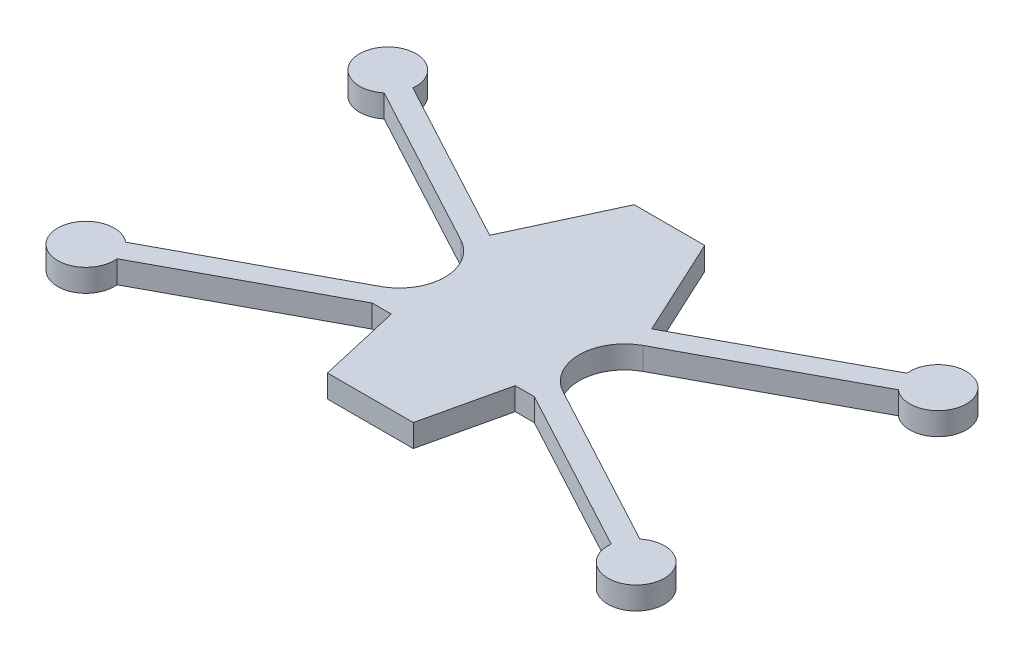
ISO-10303-21;
HEADER;
FILE_DESCRIPTION(('STEP AP214'),'2;1');
FILE_NAME('part.step','',(''),(''),'','','');
FILE_SCHEMA(('AUTOMOTIVE_DESIGN { 1 0 10303 214 1 1 1 1 }'));
ENDSEC;
DATA;
#1=APPLICATION_CONTEXT('core data for automotive mechanical design processes');
#2=APPLICATION_PROTOCOL_DEFINITION('international standard','automotive_design',2000,#1);
#3=PRODUCT_CONTEXT('',#1,'mechanical');
#4=PRODUCT('Part','Part','',(#3));
#5=PRODUCT_RELATED_PRODUCT_CATEGORY('part','',(#4));
#6=PRODUCT_DEFINITION_FORMATION('','',#4);
#7=PRODUCT_DEFINITION_CONTEXT('part definition',#1,'design');
#8=PRODUCT_DEFINITION('design','',#6,#7);
#9=PRODUCT_DEFINITION_SHAPE('','',#8);
#10=(LENGTH_UNIT() NAMED_UNIT(*) SI_UNIT(.MILLI.,.METRE.));
#11=(NAMED_UNIT(*) PLANE_ANGLE_UNIT() SI_UNIT($,.RADIAN.));
#12=(NAMED_UNIT(*) SI_UNIT($,.STERADIAN.) SOLID_ANGLE_UNIT());
#13=UNCERTAINTY_MEASURE_WITH_UNIT(LENGTH_MEASURE(1.E-05),#10,'distance_accuracy_value','');
#14=(GEOMETRIC_REPRESENTATION_CONTEXT(3) GLOBAL_UNCERTAINTY_ASSIGNED_CONTEXT((#13)) GLOBAL_UNIT_ASSIGNED_CONTEXT((#10,
#11,#12)) REPRESENTATION_CONTEXT('',''));
#15=CARTESIAN_POINT('',(0.,0.,0.));
#16=DIRECTION('',(0.,0.,1.));
#17=DIRECTION('',(1.,0.,0.));
#18=AXIS2_PLACEMENT_3D('',#15,#16,#17);
#19=CARTESIAN_POINT('',(247.65,20.32,-135.89));
#20=DIRECTION('',(0.,-1.,0.));
#21=DIRECTION('',(0.,0.,-1.));
#22=AXIS2_PLACEMENT_3D('',#19,#20,#21);
#23=CYLINDRICAL_SURFACE('',#22,25.4);
#24=CARTESIAN_POINT('',(247.65,0.,-135.89));
#25=DIRECTION('',(0.,1.,0.));
#26=DIRECTION('',(0.,0.,1.));
#27=AXIS2_PLACEMENT_3D('',#24,#25,#26);
#28=CIRCLE('',#27,25.4);
#29=CARTESIAN_POINT('',(231.416447366997,0.,-116.354602156303));
#30=VERTEX_POINT('',#29);
#31=CARTESIAN_POINT('',(222.399785176288,0.,-133.135612344567));
#32=VERTEX_POINT('',#31);
#33=EDGE_CURVE('E215',#30,#32,#28,.T.);
#34=ORIENTED_EDGE('',*,*,#33,.T.);
#35=DIRECTION('',(0.,-1.,0.));
#36=VECTOR('',#35,1.);
#37=CARTESIAN_POINT('',(222.399785176288,20.32,-133.135612344567));
#38=LINE('',#37,#36);
#39=CARTESIAN_POINT('',(222.399785176288,20.32,-133.135612344567));
#40=VERTEX_POINT('',#39);
#41=EDGE_CURVE('E11',#40,#32,#38,.T.);
#42=ORIENTED_EDGE('',*,*,#41,.F.);
#43=CARTESIAN_POINT('',(247.65,20.32,-135.89));
#44=DIRECTION('',(0.,1.,0.));
#45=DIRECTION('',(0.,0.,1.));
#46=AXIS2_PLACEMENT_3D('',#43,#44,#45);
#47=CIRCLE('',#46,25.4);
#48=CARTESIAN_POINT('',(231.416447366997,20.32,-116.354602156303));
#49=VERTEX_POINT('',#48);
#50=EDGE_CURVE('E258',#49,#40,#47,.T.);
#51=ORIENTED_EDGE('',*,*,#50,.F.);
#52=DIRECTION('',(0.,-1.,0.));
#53=VECTOR('',#52,1.);
#54=CARTESIAN_POINT('',(231.416447366997,20.32,-116.354602156303));
#55=LINE('',#54,#53);
#56=EDGE_CURVE('E211',#49,#30,#55,.T.);
#57=ORIENTED_EDGE('',*,*,#56,.T.);
#58=EDGE_LOOP('',(#34,#42,#51,#57));
#59=FACE_BOUND('',#58,.T.);
#60=ADVANCED_FACE('F35',(#59),#23,.T.);
#61=CARTESIAN_POINT('',(222.399785176288,20.32,-133.135612344567));
#62=DIRECTION('',(0.473315600562165,0.,0.880892923268474));
#63=DIRECTION('',(0.880892923268474,0.,-0.473315600562165));
#64=AXIS2_PLACEMENT_3D('',#61,#62,#63);
#65=PLANE('',#64);
#66=DIRECTION('',(-0.880892923268474,0.,0.473315600562165));
#67=VECTOR('',#66,1.);
#68=CARTESIAN_POINT('',(222.399785176288,0.,-133.135612344567));
#69=LINE('',#68,#67);
#70=CARTESIAN_POINT('',(72.9616689046454,0.,-52.8405050941322));
#71=VERTEX_POINT('',#70);
#72=EDGE_CURVE('E218',#32,#71,#69,.T.);
#73=ORIENTED_EDGE('',*,*,#72,.T.);
#74=DIRECTION('',(0.,-1.,0.));
#75=VECTOR('',#74,1.);
#76=CARTESIAN_POINT('',(72.9616689046454,20.32,-52.8405050941322));
#77=LINE('',#76,#75);
#78=CARTESIAN_POINT('',(72.9616689046454,20.32,-52.8405050941322));
#79=VERTEX_POINT('',#78);
#80=EDGE_CURVE('E43',#79,#71,#77,.T.);
#81=ORIENTED_EDGE('',*,*,#80,.F.);
#82=DIRECTION('',(-0.880892923268474,0.,0.473315600562165));
#83=VECTOR('',#82,1.);
#84=CARTESIAN_POINT('',(222.399785176288,20.32,-133.135612344567));
#85=LINE('',#84,#83);
#86=EDGE_CURVE('E136',#40,#79,#85,.T.);
#87=ORIENTED_EDGE('',*,*,#86,.F.);
#88=ORIENTED_EDGE('',*,*,#41,.T.);
#89=EDGE_LOOP('',(#73,#81,#87,#88));
#90=FACE_BOUND('',#89,.T.);
#91=ADVANCED_FACE('F386',(#90),#65,.F.);
#92=CARTESIAN_POINT('',(31.75,20.32,-141.740505094132));
#93=DIRECTION('',(-0.907255673431609,0.,0.420579532343358));
#94=DIRECTION('',(0.420579532343358,0.,0.907255673431609));
#95=AXIS2_PLACEMENT_3D('',#92,#93,#94);
#96=PLANE('',#95);
#97=DIRECTION('',(-0.420579532343359,0.,-0.907255673431609));
#98=VECTOR('',#97,1.);
#99=CARTESIAN_POINT('',(31.75,0.,-141.740505094132));
#100=LINE('',#99,#98);
#101=CARTESIAN_POINT('',(31.75,0.,-141.740505094132));
#102=VERTEX_POINT('',#101);
#103=EDGE_CURVE('E220',#71,#102,#100,.T.);
#104=ORIENTED_EDGE('',*,*,#103,.T.);
#105=DIRECTION('',(0.,-1.,0.));
#106=VECTOR('',#105,1.);
#107=CARTESIAN_POINT('',(31.75,20.32,-141.740505094132));
#108=LINE('',#107,#106);
#109=CARTESIAN_POINT('',(31.75,20.32,-141.740505094132));
#110=VERTEX_POINT('',#109);
#111=EDGE_CURVE('E307',#110,#102,#108,.T.);
#112=ORIENTED_EDGE('',*,*,#111,.F.);
#113=DIRECTION('',(-0.420579532343359,0.,-0.907255673431609));
#114=VECTOR('',#113,1.);
#115=CARTESIAN_POINT('',(31.75,20.32,-141.740505094132));
#116=LINE('',#115,#114);
#117=EDGE_CURVE('E315',#79,#110,#116,.T.);
#118=ORIENTED_EDGE('',*,*,#117,.F.);
#119=ORIENTED_EDGE('',*,*,#80,.T.);
#120=EDGE_LOOP('',(#104,#112,#118,#119));
#121=FACE_BOUND('',#120,.T.);
#122=ADVANCED_FACE('F313',(#121),#96,.F.);
#123=CARTESIAN_POINT('',(-31.75,20.32,-141.740505094132));
#124=DIRECTION('',(0.,0.,1.));
#125=DIRECTION('',(1.,0.,0.));
#126=AXIS2_PLACEMENT_3D('',#123,#124,#125);
#127=PLANE('',#126);
#128=DIRECTION('',(-1.,0.,0.));
#129=VECTOR('',#128,1.);
#130=CARTESIAN_POINT('',(-31.75,0.,-141.740505094132));
#131=LINE('',#130,#129);
#132=CARTESIAN_POINT('',(-31.75,0.,-141.740505094132));
#133=VERTEX_POINT('',#132);
#134=EDGE_CURVE('E222',#102,#133,#131,.T.);
#135=ORIENTED_EDGE('',*,*,#134,.T.);
#136=DIRECTION('',(0.,-1.,0.));
#137=VECTOR('',#136,1.);
#138=CARTESIAN_POINT('',(-31.75,20.32,-141.740505094132));
#139=LINE('',#138,#137);
#140=CARTESIAN_POINT('',(-31.75,20.32,-141.740505094132));
#141=VERTEX_POINT('',#140);
#142=EDGE_CURVE('E304',#141,#133,#139,.T.);
#143=ORIENTED_EDGE('',*,*,#142,.F.);
#144=DIRECTION('',(-1.,0.,0.));
#145=VECTOR('',#144,1.);
#146=CARTESIAN_POINT('',(-31.75,20.32,-141.740505094132));
#147=LINE('',#146,#145);
#148=EDGE_CURVE('E333',#110,#141,#147,.T.);
#149=ORIENTED_EDGE('',*,*,#148,.F.);
#150=ORIENTED_EDGE('',*,*,#111,.T.);
#151=EDGE_LOOP('',(#135,#143,#149,#150));
#152=FACE_BOUND('',#151,.T.);
#153=ADVANCED_FACE('F324',(#152),#127,.F.);
#154=CARTESIAN_POINT('',(-72.9616689046454,20.32,-52.8405050941322));
#155=DIRECTION('',(0.907255673431609,0.,0.420579532343358));
#156=DIRECTION('',(0.420579532343358,0.,-0.907255673431609));
#157=AXIS2_PLACEMENT_3D('',#154,#155,#156);
#158=PLANE('',#157);
#159=DIRECTION('',(-0.420579532343358,0.,0.907255673431609));
#160=VECTOR('',#159,1.);
#161=CARTESIAN_POINT('',(-72.9616689046454,0.,-52.8405050941322));
#162=LINE('',#161,#160);
#163=CARTESIAN_POINT('',(-72.9616689046454,0.,-52.8405050941322));
#164=VERTEX_POINT('',#163);
#165=EDGE_CURVE('E224',#133,#164,#162,.T.);
#166=ORIENTED_EDGE('',*,*,#165,.T.);
#167=DIRECTION('',(0.,-1.,0.));
#168=VECTOR('',#167,1.);
#169=CARTESIAN_POINT('',(-72.9616689046454,20.32,-52.8405050941322));
#170=LINE('',#169,#168);
#171=CARTESIAN_POINT('',(-72.9616689046454,20.32,-52.8405050941322));
#172=VERTEX_POINT('',#171);
#173=EDGE_CURVE('E301',#172,#164,#170,.T.);
#174=ORIENTED_EDGE('',*,*,#173,.F.);
#175=DIRECTION('',(-0.420579532343358,0.,0.907255673431609));
#176=VECTOR('',#175,1.);
#177=CARTESIAN_POINT('',(-72.9616689046454,20.32,-52.8405050941322));
#178=LINE('',#177,#176);
#179=EDGE_CURVE('E330',#141,#172,#178,.T.);
#180=ORIENTED_EDGE('',*,*,#179,.F.);
#181=ORIENTED_EDGE('',*,*,#142,.T.);
#182=EDGE_LOOP('',(#166,#174,#180,#181));
#183=FACE_BOUND('',#182,.T.);
#184=ADVANCED_FACE('F328',(#183),#158,.F.);
#185=CARTESIAN_POINT('',(-72.9616689046454,20.32,-52.8405050941322));
#186=DIRECTION('',(-0.473315600562164,0.,0.880892923268474));
#187=DIRECTION('',(0.880892923268474,0.,0.473315600562165));
#188=AXIS2_PLACEMENT_3D('',#185,#186,#187);
#189=PLANE('',#188);
#190=DIRECTION('',(-0.880892923268474,0.,-0.473315600562165));
#191=VECTOR('',#190,1.);
#192=CARTESIAN_POINT('',(-72.9616689046454,0.,-52.8405050941322));
#193=LINE('',#192,#191);
#194=CARTESIAN_POINT('',(-222.399785176288,0.,-133.135612344567));
#195=VERTEX_POINT('',#194);
#196=EDGE_CURVE('E226',#164,#195,#193,.T.);
#197=ORIENTED_EDGE('',*,*,#196,.T.);
#198=DIRECTION('',(0.,-1.,0.));
#199=VECTOR('',#198,1.);
#200=CARTESIAN_POINT('',(-222.399785176288,20.32,-133.135612344567));
#201=LINE('',#200,#199);
#202=CARTESIAN_POINT('',(-222.399785176288,20.32,-133.135612344567));
#203=VERTEX_POINT('',#202);
#204=EDGE_CURVE('E298',#203,#195,#201,.T.);
#205=ORIENTED_EDGE('',*,*,#204,.F.);
#206=DIRECTION('',(-0.880892923268474,0.,-0.473315600562165));
#207=VECTOR('',#206,1.);
#208=CARTESIAN_POINT('',(-72.9616689046454,20.32,-52.8405050941322));
#209=LINE('',#208,#207);
#210=EDGE_CURVE('E332',#172,#203,#209,.T.);
#211=ORIENTED_EDGE('',*,*,#210,.F.);
#212=ORIENTED_EDGE('',*,*,#173,.T.);
#213=EDGE_LOOP('',(#197,#205,#211,#212));
#214=FACE_BOUND('',#213,.T.);
#215=ADVANCED_FACE('F399',(#214),#189,.F.);
#216=CARTESIAN_POINT('',(-247.65,20.32,-135.89));
#217=DIRECTION('',(0.,-1.,0.));
#218=DIRECTION('',(0.,0.,-1.));
#219=AXIS2_PLACEMENT_3D('',#216,#217,#218);
#220=CYLINDRICAL_SURFACE('',#219,25.4);
#221=CARTESIAN_POINT('',(-247.65,0.,-135.89));
#222=DIRECTION('',(0.,1.,0.));
#223=DIRECTION('',(0.,0.,1.));
#224=AXIS2_PLACEMENT_3D('',#221,#222,#223);
#225=CIRCLE('',#224,25.4);
#226=CARTESIAN_POINT('',(-231.416447366997,0.,-116.354602156303));
#227=VERTEX_POINT('',#226);
#228=EDGE_CURVE('E228',#195,#227,#225,.T.);
#229=ORIENTED_EDGE('',*,*,#228,.T.);
#230=DIRECTION('',(0.,-1.,0.));
#231=VECTOR('',#230,1.);
#232=CARTESIAN_POINT('',(-231.416447366997,20.32,-116.354602156303));
#233=LINE('',#232,#231);
#234=CARTESIAN_POINT('',(-231.416447366997,20.32,-116.354602156303));
#235=VERTEX_POINT('',#234);
#236=EDGE_CURVE('E295',#235,#227,#233,.T.);
#237=ORIENTED_EDGE('',*,*,#236,.F.);
#238=CARTESIAN_POINT('',(-247.65,20.32,-135.89));
#239=DIRECTION('',(0.,1.,0.));
#240=DIRECTION('',(0.,0.,1.));
#241=AXIS2_PLACEMENT_3D('',#238,#239,#240);
#242=CIRCLE('',#241,25.4);
#243=EDGE_CURVE('E335',#203,#235,#242,.T.);
#244=ORIENTED_EDGE('',*,*,#243,.F.);
#245=ORIENTED_EDGE('',*,*,#204,.T.);
#246=EDGE_LOOP('',(#229,#237,#244,#245));
#247=FACE_BOUND('',#246,.T.);
#248=ADVANCED_FACE('F402',(#247),#220,.T.);
#249=CARTESIAN_POINT('',(-81.9783310953546,20.32,-36.0594949058678));
#250=DIRECTION('',(0.473315600562164,0.,-0.880892923268474));
#251=DIRECTION('',(-0.880892923268474,0.,-0.473315600562165));
#252=AXIS2_PLACEMENT_3D('',#249,#250,#251);
#253=PLANE('',#252);
#254=DIRECTION('',(0.880892923268474,0.,0.473315600562164));
#255=VECTOR('',#254,1.);
#256=CARTESIAN_POINT('',(-81.9783310953546,0.,-36.0594949058678));
#257=LINE('',#256,#255);
#258=CARTESIAN_POINT('',(-81.9783310953546,0.,-36.0594949058678));
#259=VERTEX_POINT('',#258);
#260=EDGE_CURVE('E230',#227,#259,#257,.T.);
#261=ORIENTED_EDGE('',*,*,#260,.T.);
#262=DIRECTION('',(0.,-1.,0.));
#263=VECTOR('',#262,1.);
#264=CARTESIAN_POINT('',(-81.9783310953546,20.32,-36.0594949058678));
#265=LINE('',#264,#263);
#266=CARTESIAN_POINT('',(-81.9783310953546,20.32,-36.0594949058678));
#267=VERTEX_POINT('',#266);
#268=EDGE_CURVE('E292',#267,#259,#265,.T.);
#269=ORIENTED_EDGE('',*,*,#268,.F.);
#270=DIRECTION('',(0.880892923268474,0.,0.473315600562164));
#271=VECTOR('',#270,1.);
#272=CARTESIAN_POINT('',(-81.9783310953546,20.32,-36.0594949058678));
#273=LINE('',#272,#271);
#274=EDGE_CURVE('E341',#235,#267,#273,.T.);
#275=ORIENTED_EDGE('',*,*,#274,.F.);
#276=ORIENTED_EDGE('',*,*,#236,.T.);
#277=EDGE_LOOP('',(#261,#269,#275,#276));
#278=FACE_BOUND('',#277,.T.);
#279=ADVANCED_FACE('F406',(#278),#253,.F.);
#280=CARTESIAN_POINT('',(-101.353582089552,20.32,0.));
#281=DIRECTION('',(0.,-1.,0.));
#282=DIRECTION('',(0.,0.,-1.));
#283=AXIS2_PLACEMENT_3D('',#280,#281,#282);
#284=CYLINDRICAL_SURFACE('',#283,40.9351624395758);
#285=CARTESIAN_POINT('',(-101.353582089552,0.,0.));
#286=DIRECTION('',(0.,-1.,0.));
#287=DIRECTION('',(0.,0.,-1.));
#288=AXIS2_PLACEMENT_3D('',#285,#286,#287);
#289=CIRCLE('',#288,40.9351624395758);
#290=CARTESIAN_POINT('',(-81.9783310953546,0.,36.0594949058678));
#291=VERTEX_POINT('',#290);
#292=EDGE_CURVE('E232',#259,#291,#289,.T.);
#293=ORIENTED_EDGE('',*,*,#292,.T.);
#294=DIRECTION('',(0.,-1.,0.));
#295=VECTOR('',#294,1.);
#296=CARTESIAN_POINT('',(-81.9783310953546,20.32,36.0594949058678));
#297=LINE('',#296,#295);
#298=CARTESIAN_POINT('',(-81.9783310953546,20.32,36.0594949058678));
#299=VERTEX_POINT('',#298);
#300=EDGE_CURVE('E289',#299,#291,#297,.T.);
#301=ORIENTED_EDGE('',*,*,#300,.F.);
#302=CARTESIAN_POINT('',(-101.353582089552,20.32,0.));
#303=DIRECTION('',(0.,-1.,0.));
#304=DIRECTION('',(0.,0.,-1.));
#305=AXIS2_PLACEMENT_3D('',#302,#303,#304);
#306=CIRCLE('',#305,40.9351624395758);
#307=EDGE_CURVE('E343',#267,#299,#306,.T.);
#308=ORIENTED_EDGE('',*,*,#307,.F.);
#309=ORIENTED_EDGE('',*,*,#268,.T.);
#310=EDGE_LOOP('',(#293,#301,#308,#309));
#311=FACE_BOUND('',#310,.T.);
#312=ADVANCED_FACE('F410',(#311),#284,.F.);
#313=CARTESIAN_POINT('',(-81.9783310953546,20.32,36.0594949058678));
#314=DIRECTION('',(0.473315600562165,0.,0.880892923268474));
#315=DIRECTION('',(0.880892923268474,0.,-0.473315600562165));
#316=AXIS2_PLACEMENT_3D('',#313,#314,#315);
#317=PLANE('',#316);
#318=DIRECTION('',(-0.880892923268474,0.,0.473315600562165));
#319=VECTOR('',#318,1.);
#320=CARTESIAN_POINT('',(-81.9783310953546,0.,36.0594949058678));
#321=LINE('',#320,#319);
#322=CARTESIAN_POINT('',(-231.416447366997,0.,116.354602156303));
#323=VERTEX_POINT('',#322);
#324=EDGE_CURVE('E234',#291,#323,#321,.T.);
#325=ORIENTED_EDGE('',*,*,#324,.T.);
#326=DIRECTION('',(0.,-1.,0.));
#327=VECTOR('',#326,1.);
#328=CARTESIAN_POINT('',(-231.416447366997,20.32,116.354602156303));
#329=LINE('',#328,#327);
#330=CARTESIAN_POINT('',(-231.416447366997,20.32,116.354602156303));
#331=VERTEX_POINT('',#330);
#332=EDGE_CURVE('E286',#331,#323,#329,.T.);
#333=ORIENTED_EDGE('',*,*,#332,.F.);
#334=DIRECTION('',(-0.880892923268474,0.,0.473315600562165));
#335=VECTOR('',#334,1.);
#336=CARTESIAN_POINT('',(-81.9783310953546,20.32,36.0594949058678));
#337=LINE('',#336,#335);
#338=EDGE_CURVE('E345',#299,#331,#337,.T.);
#339=ORIENTED_EDGE('',*,*,#338,.F.);
#340=ORIENTED_EDGE('',*,*,#300,.T.);
#341=EDGE_LOOP('',(#325,#333,#339,#340));
#342=FACE_BOUND('',#341,.T.);
#343=ADVANCED_FACE('F414',(#342),#317,.F.);
#344=CARTESIAN_POINT('',(-247.65,20.32,135.89));
#345=DIRECTION('',(0.,-1.,0.));
#346=DIRECTION('',(0.,0.,-1.));
#347=AXIS2_PLACEMENT_3D('',#344,#345,#346);
#348=CYLINDRICAL_SURFACE('',#347,25.4);
#349=CARTESIAN_POINT('',(-247.65,0.,135.89));
#350=DIRECTION('',(0.,1.,0.));
#351=DIRECTION('',(0.,0.,1.));
#352=AXIS2_PLACEMENT_3D('',#349,#350,#351);
#353=CIRCLE('',#352,25.4);
#354=CARTESIAN_POINT('',(-222.399785176288,0.,133.135612344567));
#355=VERTEX_POINT('',#354);
#356=EDGE_CURVE('E236',#323,#355,#353,.T.);
#357=ORIENTED_EDGE('',*,*,#356,.T.);
#358=DIRECTION('',(0.,-1.,0.));
#359=VECTOR('',#358,1.);
#360=CARTESIAN_POINT('',(-222.399785176288,20.32,133.135612344567));
#361=LINE('',#360,#359);
#362=CARTESIAN_POINT('',(-222.399785176288,20.32,133.135612344567));
#363=VERTEX_POINT('',#362);
#364=EDGE_CURVE('E283',#363,#355,#361,.T.);
#365=ORIENTED_EDGE('',*,*,#364,.F.);
#366=CARTESIAN_POINT('',(-247.65,20.32,135.89));
#367=DIRECTION('',(0.,1.,0.));
#368=DIRECTION('',(0.,0.,1.));
#369=AXIS2_PLACEMENT_3D('',#366,#367,#368);
#370=CIRCLE('',#369,25.4);
#371=EDGE_CURVE('E347',#331,#363,#370,.T.);
#372=ORIENTED_EDGE('',*,*,#371,.F.);
#373=ORIENTED_EDGE('',*,*,#332,.T.);
#374=EDGE_LOOP('',(#357,#365,#372,#373));
#375=FACE_BOUND('',#374,.T.);
#376=ADVANCED_FACE('F418',(#375),#348,.T.);
#377=CARTESIAN_POINT('',(-72.9616689046454,20.32,52.8405050941322));
#378=DIRECTION('',(-0.473315600562165,0.,-0.880892923268473));
#379=DIRECTION('',(-0.880892923268474,0.,0.473315600562165));
#380=AXIS2_PLACEMENT_3D('',#377,#378,#379);
#381=PLANE('',#380);
#382=DIRECTION('',(0.880892923268474,0.,-0.473315600562165));
#383=VECTOR('',#382,1.);
#384=CARTESIAN_POINT('',(-72.9616689046454,0.,52.8405050941322));
#385=LINE('',#384,#383);
#386=CARTESIAN_POINT('',(-72.9616689046454,0.,52.8405050941322));
#387=VERTEX_POINT('',#386);
#388=EDGE_CURVE('E238',#355,#387,#385,.T.);
#389=ORIENTED_EDGE('',*,*,#388,.T.);
#390=DIRECTION('',(0.,-1.,0.));
#391=VECTOR('',#390,1.);
#392=CARTESIAN_POINT('',(-72.9616689046454,20.32,52.8405050941322));
#393=LINE('',#392,#391);
#394=CARTESIAN_POINT('',(-72.9616689046454,20.32,52.8405050941322));
#395=VERTEX_POINT('',#394);
#396=EDGE_CURVE('E280',#395,#387,#393,.T.);
#397=ORIENTED_EDGE('',*,*,#396,.F.);
#398=DIRECTION('',(0.880892923268474,0.,-0.473315600562165));
#399=VECTOR('',#398,1.);
#400=CARTESIAN_POINT('',(-72.9616689046454,20.32,52.8405050941322));
#401=LINE('',#400,#399);
#402=EDGE_CURVE('E349',#363,#395,#401,.T.);
#403=ORIENTED_EDGE('',*,*,#402,.F.);
#404=ORIENTED_EDGE('',*,*,#364,.T.);
#405=EDGE_LOOP('',(#389,#397,#403,#404));
#406=FACE_BOUND('',#405,.T.);
#407=ADVANCED_FACE('F422',(#406),#381,.F.);
#408=CARTESIAN_POINT('',(-72.9616689046454,20.32,52.8405050941322));
#409=DIRECTION('',(0.,0.,-1.));
#410=DIRECTION('',(-1.,0.,0.));
#411=AXIS2_PLACEMENT_3D('',#408,#409,#410);
#412=PLANE('',#411);
#413=DIRECTION('',(1.,0.,0.));
#414=VECTOR('',#413,1.);
#415=CARTESIAN_POINT('',(-72.9616689046454,0.,52.8405050941322));
#416=LINE('',#415,#414);
#417=CARTESIAN_POINT('',(-55.7652117334302,0.,52.8405050941322));
#418=VERTEX_POINT('',#417);
#419=EDGE_CURVE('E240',#387,#418,#416,.T.);
#420=ORIENTED_EDGE('',*,*,#419,.T.);
#421=DIRECTION('',(0.,-1.,0.));
#422=VECTOR('',#421,1.);
#423=CARTESIAN_POINT('',(-55.7652117334302,20.32,52.8405050941322));
#424=LINE('',#423,#422);
#425=CARTESIAN_POINT('',(-55.7652117334302,20.32,52.8405050941322));
#426=VERTEX_POINT('',#425);
#427=EDGE_CURVE('E277',#426,#418,#424,.T.);
#428=ORIENTED_EDGE('',*,*,#427,.F.);
#429=DIRECTION('',(1.,0.,0.));
#430=VECTOR('',#429,1.);
#431=CARTESIAN_POINT('',(-72.9616689046454,20.32,52.8405050941322));
#432=LINE('',#431,#430);
#433=EDGE_CURVE('E351',#395,#426,#432,.T.);
#434=ORIENTED_EDGE('',*,*,#433,.F.);
#435=ORIENTED_EDGE('',*,*,#396,.T.);
#436=EDGE_LOOP('',(#420,#428,#434,#435));
#437=FACE_BOUND('',#436,.T.);
#438=ADVANCED_FACE('F426',(#437),#412,.F.);
#439=CARTESIAN_POINT('',(-55.7652117334302,20.32,52.8405050941322));
#440=DIRECTION('',(0.97464541643729,0.,-0.223755027245829));
#441=DIRECTION('',(-0.223755027245829,0.,-0.97464541643729));
#442=AXIS2_PLACEMENT_3D('',#439,#440,#441);
#443=PLANE('',#442);
#444=DIRECTION('',(0.223755027245829,0.,0.97464541643729));
#445=VECTOR('',#444,1.);
#446=CARTESIAN_POINT('',(-55.7652117334302,0.,52.8405050941322));
#447=LINE('',#446,#445);
#448=CARTESIAN_POINT('',(-38.625312424679,0.,127.499494905868));
#449=VERTEX_POINT('',#448);
#450=EDGE_CURVE('E242',#418,#449,#447,.T.);
#451=ORIENTED_EDGE('',*,*,#450,.T.);
#452=DIRECTION('',(0.,-1.,0.));
#453=VECTOR('',#452,1.);
#454=CARTESIAN_POINT('',(-38.625312424679,20.32,127.499494905868));
#455=LINE('',#454,#453);
#456=CARTESIAN_POINT('',(-38.625312424679,20.32,127.499494905868));
#457=VERTEX_POINT('',#456);
#458=EDGE_CURVE('E274',#457,#449,#455,.T.);
#459=ORIENTED_EDGE('',*,*,#458,.F.);
#460=DIRECTION('',(0.223755027245829,0.,0.97464541643729));
#461=VECTOR('',#460,1.);
#462=CARTESIAN_POINT('',(-55.7652117334302,20.32,52.8405050941322));
#463=LINE('',#462,#461);
#464=EDGE_CURVE('E353',#426,#457,#463,.T.);
#465=ORIENTED_EDGE('',*,*,#464,.F.);
#466=ORIENTED_EDGE('',*,*,#427,.T.);
#467=EDGE_LOOP('',(#451,#459,#465,#466));
#468=FACE_BOUND('',#467,.T.);
#469=ADVANCED_FACE('F430',(#468),#443,.F.);
#470=CARTESIAN_POINT('',(38.6253124246792,20.32,127.499494905868));
#471=DIRECTION('',(0.,0.,-1.));
#472=DIRECTION('',(-1.,0.,0.));
#473=AXIS2_PLACEMENT_3D('',#470,#471,#472);
#474=PLANE('',#473);
#475=DIRECTION('',(1.,0.,0.));
#476=VECTOR('',#475,1.);
#477=CARTESIAN_POINT('',(38.6253124246792,0.,127.499494905868));
#478=LINE('',#477,#476);
#479=CARTESIAN_POINT('',(38.6253124246792,0.,127.499494905868));
#480=VERTEX_POINT('',#479);
#481=EDGE_CURVE('E245',#449,#480,#478,.T.);
#482=ORIENTED_EDGE('',*,*,#481,.T.);
#483=DIRECTION('',(0.,-1.,0.));
#484=VECTOR('',#483,1.);
#485=CARTESIAN_POINT('',(38.6253124246792,20.32,127.499494905868));
#486=LINE('',#485,#484);
#487=CARTESIAN_POINT('',(38.6253124246792,20.32,127.499494905868));
#488=VERTEX_POINT('',#487);
#489=EDGE_CURVE('E271',#488,#480,#486,.T.);
#490=ORIENTED_EDGE('',*,*,#489,.F.);
#491=DIRECTION('',(1.,0.,0.));
#492=VECTOR('',#491,1.);
#493=CARTESIAN_POINT('',(-38.625312424679,20.32,127.499494905868));
#494=LINE('',#493,#492);
#495=EDGE_CURVE('E355',#457,#488,#494,.T.);
#496=ORIENTED_EDGE('',*,*,#495,.F.);
#497=ORIENTED_EDGE('',*,*,#458,.T.);
#498=EDGE_LOOP('',(#482,#490,#496,#497));
#499=FACE_BOUND('',#498,.T.);
#500=ADVANCED_FACE('F434',(#499),#474,.F.);
#501=CARTESIAN_POINT('',(55.7652117334301,20.32,52.8405050941322));
#502=DIRECTION('',(-0.97464541643729,0.,-0.223755027245827));
#503=DIRECTION('',(-0.223755027245827,0.,0.974645416437291));
#504=AXIS2_PLACEMENT_3D('',#501,#502,#503);
#505=PLANE('',#504);
#506=DIRECTION('',(0.223755027245827,0.,-0.97464541643729));
#507=VECTOR('',#506,1.);
#508=CARTESIAN_POINT('',(55.7652117334301,0.,52.8405050941322));
#509=LINE('',#508,#507);
#510=CARTESIAN_POINT('',(55.7652117334301,0.,52.8405050941322));
#511=VERTEX_POINT('',#510);
#512=EDGE_CURVE('E247',#480,#511,#509,.T.);
#513=ORIENTED_EDGE('',*,*,#512,.T.);
#514=DIRECTION('',(0.,-1.,0.));
#515=VECTOR('',#514,1.);
#516=CARTESIAN_POINT('',(55.7652117334301,20.32,52.8405050941322));
#517=LINE('',#516,#515);
#518=CARTESIAN_POINT('',(55.7652117334301,20.32,52.8405050941322));
#519=VERTEX_POINT('',#518);
#520=EDGE_CURVE('E268',#519,#511,#517,.T.);
#521=ORIENTED_EDGE('',*,*,#520,.F.);
#522=DIRECTION('',(0.223755027245827,0.,-0.97464541643729));
#523=VECTOR('',#522,1.);
#524=CARTESIAN_POINT('',(55.7652117334301,20.32,52.8405050941322));
#525=LINE('',#524,#523);
#526=EDGE_CURVE('E357',#488,#519,#525,.T.);
#527=ORIENTED_EDGE('',*,*,#526,.F.);
#528=ORIENTED_EDGE('',*,*,#489,.T.);
#529=EDGE_LOOP('',(#513,#521,#527,#528));
#530=FACE_BOUND('',#529,.T.);
#531=ADVANCED_FACE('F438',(#530),#505,.F.);
#532=CARTESIAN_POINT('',(72.9616689046454,20.32,52.8405050941322));
#533=DIRECTION('',(0.,0.,-1.));
#534=DIRECTION('',(-1.,0.,0.));
#535=AXIS2_PLACEMENT_3D('',#532,#533,#534);
#536=PLANE('',#535);
#537=DIRECTION('',(1.,0.,0.));
#538=VECTOR('',#537,1.);
#539=CARTESIAN_POINT('',(72.9616689046454,0.,52.8405050941322));
#540=LINE('',#539,#538);
#541=CARTESIAN_POINT('',(72.9616689046454,0.,52.8405050941322));
#542=VERTEX_POINT('',#541);
#543=EDGE_CURVE('E249',#511,#542,#540,.T.);
#544=ORIENTED_EDGE('',*,*,#543,.T.);
#545=DIRECTION('',(0.,-1.,0.));
#546=VECTOR('',#545,1.);
#547=CARTESIAN_POINT('',(72.9616689046454,20.32,52.8405050941322));
#548=LINE('',#547,#546);
#549=CARTESIAN_POINT('',(72.9616689046454,20.32,52.8405050941322));
#550=VERTEX_POINT('',#549);
#551=EDGE_CURVE('E265',#550,#542,#548,.T.);
#552=ORIENTED_EDGE('',*,*,#551,.F.);
#553=DIRECTION('',(1.,0.,0.));
#554=VECTOR('',#553,1.);
#555=CARTESIAN_POINT('',(72.9616689046454,20.32,52.8405050941322));
#556=LINE('',#555,#554);
#557=EDGE_CURVE('E359',#519,#550,#556,.T.);
#558=ORIENTED_EDGE('',*,*,#557,.F.);
#559=ORIENTED_EDGE('',*,*,#520,.T.);
#560=EDGE_LOOP('',(#544,#552,#558,#559));
#561=FACE_BOUND('',#560,.T.);
#562=ADVANCED_FACE('F442',(#561),#536,.F.);
#563=CARTESIAN_POINT('',(72.9616689046454,20.32,52.8405050941322));
#564=DIRECTION('',(0.473315600562165,0.,-0.880892923268474));
#565=DIRECTION('',(-0.880892923268474,0.,-0.473315600562165));
#566=AXIS2_PLACEMENT_3D('',#563,#564,#565);
#567=PLANE('',#566);
#568=DIRECTION('',(0.880892923268473,0.,0.473315600562165));
#569=VECTOR('',#568,1.);
#570=CARTESIAN_POINT('',(72.9616689046454,0.,52.8405050941322));
#571=LINE('',#570,#569);
#572=CARTESIAN_POINT('',(222.399785176288,0.,133.135612344567));
#573=VERTEX_POINT('',#572);
#574=EDGE_CURVE('E251',#542,#573,#571,.T.);
#575=ORIENTED_EDGE('',*,*,#574,.T.);
#576=DIRECTION('',(0.,-1.,0.));
#577=VECTOR('',#576,1.);
#578=CARTESIAN_POINT('',(222.399785176288,20.32,133.135612344567));
#579=LINE('',#578,#577);
#580=CARTESIAN_POINT('',(222.399785176288,20.32,133.135612344567));
#581=VERTEX_POINT('',#580);
#582=EDGE_CURVE('E262',#581,#573,#579,.T.);
#583=ORIENTED_EDGE('',*,*,#582,.F.);
#584=DIRECTION('',(0.880892923268473,0.,0.473315600562165));
#585=VECTOR('',#584,1.);
#586=CARTESIAN_POINT('',(72.9616689046454,20.32,52.8405050941322));
#587=LINE('',#586,#585);
#588=EDGE_CURVE('E361',#550,#581,#587,.T.);
#589=ORIENTED_EDGE('',*,*,#588,.F.);
#590=ORIENTED_EDGE('',*,*,#551,.T.);
#591=EDGE_LOOP('',(#575,#583,#589,#590));
#592=FACE_BOUND('',#591,.T.);
#593=ADVANCED_FACE('F367',(#592),#567,.F.);
#594=CARTESIAN_POINT('',(247.65,20.32,135.89));
#595=DIRECTION('',(0.,-1.,0.));
#596=DIRECTION('',(0.,0.,-1.));
#597=AXIS2_PLACEMENT_3D('',#594,#595,#596);
#598=CYLINDRICAL_SURFACE('',#597,25.4);
#599=CARTESIAN_POINT('',(247.65,0.,135.89));
#600=DIRECTION('',(0.,1.,0.));
#601=DIRECTION('',(0.,0.,1.));
#602=AXIS2_PLACEMENT_3D('',#599,#600,#601);
#603=CIRCLE('',#602,25.4);
#604=CARTESIAN_POINT('',(231.416447366997,0.,116.354602156303));
#605=VERTEX_POINT('',#604);
#606=EDGE_CURVE('E253',#573,#605,#603,.T.);
#607=ORIENTED_EDGE('',*,*,#606,.T.);
#608=DIRECTION('',(0.,-1.,0.));
#609=VECTOR('',#608,1.);
#610=CARTESIAN_POINT('',(231.416447366997,20.32,116.354602156303));
#611=LINE('',#610,#609);
#612=CARTESIAN_POINT('',(231.416447366997,20.32,116.354602156303));
#613=VERTEX_POINT('',#612);
#614=EDGE_CURVE('E206',#613,#605,#611,.T.);
#615=ORIENTED_EDGE('',*,*,#614,.F.);
#616=CARTESIAN_POINT('',(247.65,20.32,135.89));
#617=DIRECTION('',(0.,1.,0.));
#618=DIRECTION('',(0.,0.,1.));
#619=AXIS2_PLACEMENT_3D('',#616,#617,#618);
#620=CIRCLE('',#619,25.4);
#621=EDGE_CURVE('E197',#581,#613,#620,.T.);
#622=ORIENTED_EDGE('',*,*,#621,.F.);
#623=ORIENTED_EDGE('',*,*,#582,.T.);
#624=EDGE_LOOP('',(#607,#615,#622,#623));
#625=FACE_BOUND('',#624,.T.);
#626=ADVANCED_FACE('F371',(#625),#598,.T.);
#627=CARTESIAN_POINT('',(81.9783310953546,20.32,36.0594949058678));
#628=DIRECTION('',(-0.473315600562165,0.,0.880892923268474));
#629=DIRECTION('',(0.880892923268474,0.,0.473315600562165));
#630=AXIS2_PLACEMENT_3D('',#627,#628,#629);
#631=PLANE('',#630);
#632=DIRECTION('',(-0.880892923268473,0.,-0.473315600562165));
#633=VECTOR('',#632,1.);
#634=CARTESIAN_POINT('',(81.9783310953546,0.,36.0594949058678));
#635=LINE('',#634,#633);
#636=CARTESIAN_POINT('',(81.9783310953546,0.,36.0594949058678));
#637=VERTEX_POINT('',#636);
#638=EDGE_CURVE('E205',#605,#637,#635,.T.);
#639=ORIENTED_EDGE('',*,*,#638,.T.);
#640=DIRECTION('',(0.,-1.,0.));
#641=VECTOR('',#640,1.);
#642=CARTESIAN_POINT('',(81.9783310953546,20.32,36.0594949058678));
#643=LINE('',#642,#641);
#644=CARTESIAN_POINT('',(81.9783310953546,20.32,36.0594949058678));
#645=VERTEX_POINT('',#644);
#646=EDGE_CURVE('E202',#645,#637,#643,.T.);
#647=ORIENTED_EDGE('',*,*,#646,.F.);
#648=DIRECTION('',(-0.880892923268473,0.,-0.473315600562165));
#649=VECTOR('',#648,1.);
#650=CARTESIAN_POINT('',(81.9783310953546,20.32,36.0594949058678));
#651=LINE('',#650,#649);
#652=EDGE_CURVE('E191',#613,#645,#651,.T.);
#653=ORIENTED_EDGE('',*,*,#652,.F.);
#654=ORIENTED_EDGE('',*,*,#614,.T.);
#655=EDGE_LOOP('',(#639,#647,#653,#654));
#656=FACE_BOUND('',#655,.T.);
#657=ADVANCED_FACE('F203',(#656),#631,.F.);
#658=CARTESIAN_POINT('',(101.353582089552,20.32,0.));
#659=DIRECTION('',(0.,-1.,0.));
#660=DIRECTION('',(0.,0.,-1.));
#661=AXIS2_PLACEMENT_3D('',#658,#659,#660);
#662=CYLINDRICAL_SURFACE('',#661,40.9351624395758);
#663=CARTESIAN_POINT('',(101.353582089552,0.,0.));
#664=DIRECTION('',(0.,-1.,0.));
#665=DIRECTION('',(0.,0.,1.));
#666=AXIS2_PLACEMENT_3D('',#663,#664,#665);
#667=CIRCLE('',#666,40.9351624395758);
#668=CARTESIAN_POINT('',(81.9783310953546,0.,-36.0594949058678));
#669=VERTEX_POINT('',#668);
#670=EDGE_CURVE('E122',#637,#669,#667,.T.);
#671=ORIENTED_EDGE('',*,*,#670,.T.);
#672=DIRECTION('',(0.,-1.,0.));
#673=VECTOR('',#672,1.);
#674=CARTESIAN_POINT('',(81.9783310953546,20.32,-36.0594949058678));
#675=LINE('',#674,#673);
#676=CARTESIAN_POINT('',(81.9783310953546,20.32,-36.0594949058678));
#677=VERTEX_POINT('',#676);
#678=EDGE_CURVE('E207',#677,#669,#675,.T.);
#679=ORIENTED_EDGE('',*,*,#678,.F.);
#680=CARTESIAN_POINT('',(101.353582089552,20.32,0.));
#681=DIRECTION('',(0.,-1.,0.));
#682=DIRECTION('',(0.,0.,1.));
#683=AXIS2_PLACEMENT_3D('',#680,#681,#682);
#684=CIRCLE('',#683,40.9351624395758);
#685=EDGE_CURVE('E195',#645,#677,#684,.T.);
#686=ORIENTED_EDGE('',*,*,#685,.F.);
#687=ORIENTED_EDGE('',*,*,#646,.T.);
#688=EDGE_LOOP('',(#671,#679,#686,#687));
#689=FACE_BOUND('',#688,.T.);
#690=ADVANCED_FACE('F209',(#689),#662,.F.);
#691=CARTESIAN_POINT('',(231.416447366997,20.32,-116.354602156303));
#692=DIRECTION('',(-0.473315600562165,0.,-0.880892923268474));
#693=DIRECTION('',(-0.880892923268474,0.,0.473315600562165));
#694=AXIS2_PLACEMENT_3D('',#691,#692,#693);
#695=PLANE('',#694);
#696=DIRECTION('',(0.880892923268474,0.,-0.473315600562165));
#697=VECTOR('',#696,1.);
#698=CARTESIAN_POINT('',(231.416447366997,0.,-116.354602156303));
#699=LINE('',#698,#697);
#700=EDGE_CURVE('E128',#669,#30,#699,.T.);
#701=ORIENTED_EDGE('',*,*,#700,.T.);
#702=ORIENTED_EDGE('',*,*,#56,.F.);
#703=DIRECTION('',(0.880892923268474,0.,-0.473315600562165));
#704=VECTOR('',#703,1.);
#705=CARTESIAN_POINT('',(231.416447366997,20.32,-116.354602156303));
#706=LINE('',#705,#704);
#707=EDGE_CURVE('E51',#677,#49,#706,.T.);
#708=ORIENTED_EDGE('',*,*,#707,.F.);
#709=ORIENTED_EDGE('',*,*,#678,.T.);
#710=EDGE_LOOP('',(#701,#702,#708,#709));
#711=FACE_BOUND('',#710,.T.);
#712=ADVANCED_FACE('F375',(#711),#695,.F.);
#713=CARTESIAN_POINT('',(247.65,20.32,-135.89));
#714=DIRECTION('',(0.,1.,0.));
#715=DIRECTION('',(0.,0.,1.));
#716=AXIS2_PLACEMENT_3D('',#713,#714,#715);
#717=PLANE('',#716);
#718=ORIENTED_EDGE('',*,*,#50,.T.);
#719=ORIENTED_EDGE('',*,*,#86,.T.);
#720=ORIENTED_EDGE('',*,*,#117,.T.);
#721=ORIENTED_EDGE('',*,*,#148,.T.);
#722=ORIENTED_EDGE('',*,*,#179,.T.);
#723=ORIENTED_EDGE('',*,*,#210,.T.);
#724=ORIENTED_EDGE('',*,*,#243,.T.);
#725=ORIENTED_EDGE('',*,*,#274,.T.);
#726=ORIENTED_EDGE('',*,*,#307,.T.);
#727=ORIENTED_EDGE('',*,*,#338,.T.);
#728=ORIENTED_EDGE('',*,*,#371,.T.);
#729=ORIENTED_EDGE('',*,*,#402,.T.);
#730=ORIENTED_EDGE('',*,*,#433,.T.);
#731=ORIENTED_EDGE('',*,*,#464,.T.);
#732=ORIENTED_EDGE('',*,*,#495,.T.);
#733=ORIENTED_EDGE('',*,*,#526,.T.);
#734=ORIENTED_EDGE('',*,*,#557,.T.);
#735=ORIENTED_EDGE('',*,*,#588,.T.);
#736=ORIENTED_EDGE('',*,*,#621,.T.);
#737=ORIENTED_EDGE('',*,*,#652,.T.);
#738=ORIENTED_EDGE('',*,*,#685,.T.);
#739=ORIENTED_EDGE('',*,*,#707,.T.);
#740=EDGE_LOOP('',(#718,#719,#720,#721,#722,#723,#724,#725,#726,#727,#728,#729,#730,#731,#732,
#733,#734,#735,#736,#737,#738,#739));
#741=FACE_BOUND('',#740,.T.);
#742=ADVANCED_FACE('F193',(#741),#717,.T.);
#743=CARTESIAN_POINT('',(247.65,0.,-135.89));
#744=DIRECTION('',(0.,1.,0.));
#745=DIRECTION('',(0.,0.,1.));
#746=AXIS2_PLACEMENT_3D('',#743,#744,#745);
#747=PLANE('',#746);
#748=ORIENTED_EDGE('',*,*,#33,.F.);
#749=ORIENTED_EDGE('',*,*,#700,.F.);
#750=ORIENTED_EDGE('',*,*,#670,.F.);
#751=ORIENTED_EDGE('',*,*,#638,.F.);
#752=ORIENTED_EDGE('',*,*,#606,.F.);
#753=ORIENTED_EDGE('',*,*,#574,.F.);
#754=ORIENTED_EDGE('',*,*,#543,.F.);
#755=ORIENTED_EDGE('',*,*,#512,.F.);
#756=ORIENTED_EDGE('',*,*,#481,.F.);
#757=ORIENTED_EDGE('',*,*,#450,.F.);
#758=ORIENTED_EDGE('',*,*,#419,.F.);
#759=ORIENTED_EDGE('',*,*,#388,.F.);
#760=ORIENTED_EDGE('',*,*,#356,.F.);
#761=ORIENTED_EDGE('',*,*,#324,.F.);
#762=ORIENTED_EDGE('',*,*,#292,.F.);
#763=ORIENTED_EDGE('',*,*,#260,.F.);
#764=ORIENTED_EDGE('',*,*,#228,.F.);
#765=ORIENTED_EDGE('',*,*,#196,.F.);
#766=ORIENTED_EDGE('',*,*,#165,.F.);
#767=ORIENTED_EDGE('',*,*,#134,.F.);
#768=ORIENTED_EDGE('',*,*,#103,.F.);
#769=ORIENTED_EDGE('',*,*,#72,.F.);
#770=EDGE_LOOP('',(#748,#749,#750,#751,#752,#753,#754,#755,#756,#757,#758,#759,#760,#761,#762,
#763,#764,#765,#766,#767,#768,#769));
#771=FACE_BOUND('',#770,.T.);
#772=ADVANCED_FACE('F319',(#771),#747,.F.);
#773=CLOSED_SHELL('',(#60,#91,#122,#153,#184,#215,#248,#279,#312,#343,#376,#407,#438,#469,#500,
#531,#562,#593,#626,#657,#690,#712,#742,#772));
#774=MANIFOLD_SOLID_BREP('B2',#773);
#775=ADVANCED_BREP_SHAPE_REPRESENTATION('',(#18,#774),#14);
#776=SHAPE_DEFINITION_REPRESENTATION(#9,#775);
ENDSEC;
END-ISO-10303-21;
